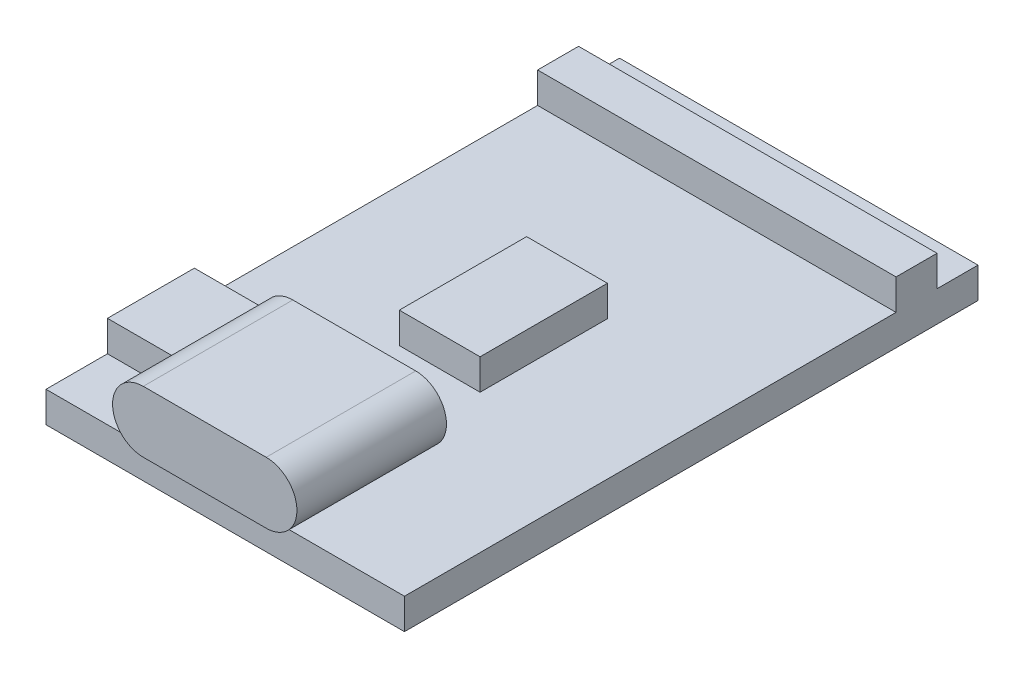
ISO-10303-21;
HEADER;
FILE_DESCRIPTION(('STEP AP214'),'2;1');
FILE_NAME('part.step','',(''),(''),'','','');
FILE_SCHEMA(('AUTOMOTIVE_DESIGN { 1 0 10303 214 1 1 1 1 }'));
ENDSEC;
DATA;
#1=APPLICATION_CONTEXT('core data for automotive mechanical design processes');
#2=APPLICATION_PROTOCOL_DEFINITION('international standard','automotive_design',2000,#1);
#3=PRODUCT_CONTEXT('',#1,'mechanical');
#4=PRODUCT('Part','Part','',(#3));
#5=PRODUCT_RELATED_PRODUCT_CATEGORY('part','',(#4));
#6=PRODUCT_DEFINITION_FORMATION('','',#4);
#7=PRODUCT_DEFINITION_CONTEXT('part definition',#1,'design');
#8=PRODUCT_DEFINITION('design','',#6,#7);
#9=PRODUCT_DEFINITION_SHAPE('','',#8);
#10=(LENGTH_UNIT() NAMED_UNIT(*) SI_UNIT(.MILLI.,.METRE.));
#11=(NAMED_UNIT(*) PLANE_ANGLE_UNIT() SI_UNIT($,.RADIAN.));
#12=(NAMED_UNIT(*) SI_UNIT($,.STERADIAN.) SOLID_ANGLE_UNIT());
#13=UNCERTAINTY_MEASURE_WITH_UNIT(LENGTH_MEASURE(1.E-05),#10,'distance_accuracy_value','');
#14=(GEOMETRIC_REPRESENTATION_CONTEXT(3) GLOBAL_UNCERTAINTY_ASSIGNED_CONTEXT((#13)) GLOBAL_UNIT_ASSIGNED_CONTEXT((#10,
#11,#12)) REPRESENTATION_CONTEXT('',''));
#15=CARTESIAN_POINT('',(0.,0.,0.));
#16=DIRECTION('',(0.,0.,1.));
#17=DIRECTION('',(1.,0.,0.));
#18=AXIS2_PLACEMENT_3D('',#15,#16,#17);
#19=CARTESIAN_POINT('',(-3.,3.5,-6.3));
#20=DIRECTION('',(0.,0.,1.));
#21=DIRECTION('',(1.,0.,0.));
#22=AXIS2_PLACEMENT_3D('',#19,#20,#21);
#23=CYLINDRICAL_SURFACE('',#22,1.5);
#24=CARTESIAN_POINT('',(-3.,3.5,1.));
#25=DIRECTION('',(0.,0.,1.));
#26=DIRECTION('',(1.,0.,0.));
#27=AXIS2_PLACEMENT_3D('',#24,#25,#26);
#28=CIRCLE('',#27,1.5);
#29=CARTESIAN_POINT('',(-3.,5.,1.));
#30=VERTEX_POINT('',#29);
#31=CARTESIAN_POINT('',(-3.,2.,1.));
#32=VERTEX_POINT('',#31);
#33=EDGE_CURVE('E119',#30,#32,#28,.T.);
#34=ORIENTED_EDGE('',*,*,#33,.F.);
#35=DIRECTION('',(0.,0.,1.));
#36=VECTOR('',#35,1.);
#37=CARTESIAN_POINT('',(-3.,5.,-6.3));
#38=LINE('',#37,#36);
#39=CARTESIAN_POINT('',(-3.,5.,-6.3));
#40=VERTEX_POINT('',#39);
#41=EDGE_CURVE('E14',#40,#30,#38,.T.);
#42=ORIENTED_EDGE('',*,*,#41,.F.);
#43=CARTESIAN_POINT('',(-3.,3.5,-6.3));
#44=DIRECTION('',(0.,0.,1.));
#45=DIRECTION('',(1.,0.,0.));
#46=AXIS2_PLACEMENT_3D('',#43,#44,#45);
#47=CIRCLE('',#46,1.5);
#48=CARTESIAN_POINT('',(-3.,2.,-6.3));
#49=VERTEX_POINT('',#48);
#50=EDGE_CURVE('E113',#40,#49,#47,.T.);
#51=ORIENTED_EDGE('',*,*,#50,.T.);
#52=DIRECTION('',(0.,0.,1.));
#53=VECTOR('',#52,1.);
#54=CARTESIAN_POINT('',(-3.,2.,-6.3));
#55=LINE('',#54,#53);
#56=EDGE_CURVE('E58',#49,#32,#55,.T.);
#57=ORIENTED_EDGE('',*,*,#56,.T.);
#58=EDGE_LOOP('',(#34,#42,#51,#57));
#59=FACE_BOUND('',#58,.T.);
#60=ADVANCED_FACE('F55',(#59),#23,.T.);
#61=CARTESIAN_POINT('',(-3.,5.,-6.3));
#62=DIRECTION('',(0.,1.,0.));
#63=DIRECTION('',(-1.,0.,0.));
#64=AXIS2_PLACEMENT_3D('',#61,#62,#63);
#65=PLANE('',#64);
#66=DIRECTION('',(-1.,0.,0.));
#67=VECTOR('',#66,1.);
#68=CARTESIAN_POINT('',(-3.,5.,1.));
#69=LINE('',#68,#67);
#70=CARTESIAN_POINT('',(3.,5.,1.));
#71=VERTEX_POINT('',#70);
#72=EDGE_CURVE('E115',#71,#30,#69,.T.);
#73=ORIENTED_EDGE('',*,*,#72,.F.);
#74=DIRECTION('',(0.,0.,1.));
#75=VECTOR('',#74,1.);
#76=CARTESIAN_POINT('',(3.,5.,-6.3));
#77=LINE('',#76,#75);
#78=CARTESIAN_POINT('',(3.,5.,-6.3));
#79=VERTEX_POINT('',#78);
#80=EDGE_CURVE('E64',#79,#71,#77,.T.);
#81=ORIENTED_EDGE('',*,*,#80,.F.);
#82=DIRECTION('',(-1.,0.,0.));
#83=VECTOR('',#82,1.);
#84=CARTESIAN_POINT('',(-3.,5.,-6.3));
#85=LINE('',#84,#83);
#86=EDGE_CURVE('E110',#79,#40,#85,.T.);
#87=ORIENTED_EDGE('',*,*,#86,.T.);
#88=ORIENTED_EDGE('',*,*,#41,.T.);
#89=EDGE_LOOP('',(#73,#81,#87,#88));
#90=FACE_BOUND('',#89,.T.);
#91=ADVANCED_FACE('F129',(#90),#65,.T.);
#92=CARTESIAN_POINT('',(3.,3.5,-6.3));
#93=DIRECTION('',(0.,0.,1.));
#94=DIRECTION('',(1.,0.,0.));
#95=AXIS2_PLACEMENT_3D('',#92,#93,#94);
#96=CYLINDRICAL_SURFACE('',#95,1.5);
#97=CARTESIAN_POINT('',(3.,3.5,1.));
#98=DIRECTION('',(0.,0.,1.));
#99=DIRECTION('',(1.,0.,0.));
#100=AXIS2_PLACEMENT_3D('',#97,#98,#99);
#101=CIRCLE('',#100,1.5);
#102=CARTESIAN_POINT('',(3.,2.,1.));
#103=VERTEX_POINT('',#102);
#104=EDGE_CURVE('E105',#103,#71,#101,.T.);
#105=ORIENTED_EDGE('',*,*,#104,.F.);
#106=DIRECTION('',(0.,0.,1.));
#107=VECTOR('',#106,1.);
#108=CARTESIAN_POINT('',(3.,2.,-6.3));
#109=LINE('',#108,#107);
#110=CARTESIAN_POINT('',(3.,2.,-6.3));
#111=VERTEX_POINT('',#110);
#112=EDGE_CURVE('E100',#111,#103,#109,.T.);
#113=ORIENTED_EDGE('',*,*,#112,.F.);
#114=CARTESIAN_POINT('',(3.,3.5,-6.3));
#115=DIRECTION('',(0.,0.,1.));
#116=DIRECTION('',(1.,0.,0.));
#117=AXIS2_PLACEMENT_3D('',#114,#115,#116);
#118=CIRCLE('',#117,1.5);
#119=EDGE_CURVE('E103',#111,#79,#118,.T.);
#120=ORIENTED_EDGE('',*,*,#119,.T.);
#121=ORIENTED_EDGE('',*,*,#80,.T.);
#122=EDGE_LOOP('',(#105,#113,#120,#121));
#123=FACE_BOUND('',#122,.T.);
#124=ADVANCED_FACE('F102',(#123),#96,.T.);
#125=CARTESIAN_POINT('',(-3.,2.,-6.3));
#126=DIRECTION('',(0.,-1.,0.));
#127=DIRECTION('',(1.,0.,0.));
#128=AXIS2_PLACEMENT_3D('',#125,#126,#127);
#129=PLANE('',#128);
#130=DIRECTION('',(1.,0.,0.));
#131=VECTOR('',#130,1.);
#132=CARTESIAN_POINT('',(-3.,2.,1.));
#133=LINE('',#132,#131);
#134=EDGE_CURVE('E122',#32,#103,#133,.T.);
#135=ORIENTED_EDGE('',*,*,#134,.F.);
#136=ORIENTED_EDGE('',*,*,#56,.F.);
#137=DIRECTION('',(1.,0.,0.));
#138=VECTOR('',#137,1.);
#139=CARTESIAN_POINT('',(-3.,2.,-6.3));
#140=LINE('',#139,#138);
#141=EDGE_CURVE('E109',#49,#111,#140,.T.);
#142=ORIENTED_EDGE('',*,*,#141,.T.);
#143=ORIENTED_EDGE('',*,*,#112,.T.);
#144=EDGE_LOOP('',(#135,#136,#142,#143));
#145=FACE_BOUND('',#144,.T.);
#146=ADVANCED_FACE('F112',(#145),#129,.T.);
#147=CARTESIAN_POINT('',(-3.,3.5,-6.3));
#148=DIRECTION('',(0.,0.,1.));
#149=DIRECTION('',(1.,0.,0.));
#150=AXIS2_PLACEMENT_3D('',#147,#148,#149);
#151=PLANE('',#150);
#152=ORIENTED_EDGE('',*,*,#50,.F.);
#153=ORIENTED_EDGE('',*,*,#86,.F.);
#154=ORIENTED_EDGE('',*,*,#119,.F.);
#155=ORIENTED_EDGE('',*,*,#141,.F.);
#156=EDGE_LOOP('',(#152,#153,#154,#155));
#157=FACE_BOUND('',#156,.T.);
#158=ADVANCED_FACE('F108',(#157),#151,.F.);
#159=CARTESIAN_POINT('',(-3.,3.5,1.));
#160=DIRECTION('',(0.,0.,1.));
#161=DIRECTION('',(1.,0.,0.));
#162=AXIS2_PLACEMENT_3D('',#159,#160,#161);
#163=PLANE('',#162);
#164=ORIENTED_EDGE('',*,*,#33,.T.);
#165=ORIENTED_EDGE('',*,*,#134,.T.);
#166=ORIENTED_EDGE('',*,*,#104,.T.);
#167=ORIENTED_EDGE('',*,*,#72,.T.);
#168=EDGE_LOOP('',(#164,#165,#166,#167));
#169=FACE_BOUND('',#168,.T.);
#170=ADVANCED_FACE('F128',(#169),#163,.T.);
#171=CLOSED_SHELL('',(#60,#91,#124,#146,#158,#170));
#172=MANIFOLD_SOLID_BREP('B2',#171);
#173=CARTESIAN_POINT('',(0.,1.5,0.));
#174=DIRECTION('',(0.,-1.,0.));
#175=DIRECTION('',(0.,0.,-1.));
#176=AXIS2_PLACEMENT_3D('',#173,#174,#175);
#177=PLANE('',#176);
#178=DIRECTION('',(0.,0.,1.));
#179=VECTOR('',#178,1.);
#180=CARTESIAN_POINT('',(-1.97208331803018,1.5,0.));
#181=LINE('',#180,#179);
#182=CARTESIAN_POINT('',(-1.97208331803018,1.5,-16.6852062003594));
#183=VERTEX_POINT('',#182);
#184=CARTESIAN_POINT('',(-1.97208331803018,1.5,-10.470155743537));
#185=VERTEX_POINT('',#184);
#186=EDGE_CURVE('E379',#183,#185,#181,.T.);
#187=ORIENTED_EDGE('',*,*,#186,.F.);
#188=DIRECTION('',(-1.,0.,0.));
#189=VECTOR('',#188,1.);
#190=CARTESIAN_POINT('',(0.,1.5,-16.6852062003594));
#191=LINE('',#190,#189);
#192=CARTESIAN_POINT('',(1.97208331803018,1.5,-16.6852062003594));
#193=VERTEX_POINT('',#192);
#194=EDGE_CURVE('E370',#193,#183,#191,.T.);
#195=ORIENTED_EDGE('',*,*,#194,.F.);
#196=DIRECTION('',(0.,0.,-1.));
#197=VECTOR('',#196,1.);
#198=CARTESIAN_POINT('',(1.97208331803019,1.5,0.));
#199=LINE('',#198,#197);
#200=CARTESIAN_POINT('',(1.97208331803018,1.5,-10.470155743537));
#201=VERTEX_POINT('',#200);
#202=EDGE_CURVE('E373',#201,#193,#199,.T.);
#203=ORIENTED_EDGE('',*,*,#202,.F.);
#204=DIRECTION('',(1.,0.,0.));
#205=VECTOR('',#204,1.);
#206=CARTESIAN_POINT('',(0.,1.5,-10.470155743537));
#207=LINE('',#206,#205);
#208=EDGE_CURVE('E376',#185,#201,#207,.T.);
#209=ORIENTED_EDGE('',*,*,#208,.F.);
#210=EDGE_LOOP('',(#187,#195,#203,#209));
#211=FACE_BOUND('',#210,.T.);
#212=DIRECTION('',(1.,0.,0.));
#213=VECTOR('',#212,1.);
#214=CARTESIAN_POINT('',(0.,1.5,-24.));
#215=LINE('',#214,#213);
#216=CARTESIAN_POINT('',(-8.75000000000001,1.5,-24.));
#217=VERTEX_POINT('',#216);
#218=CARTESIAN_POINT('',(8.75,1.5,-24.));
#219=VERTEX_POINT('',#218);
#220=EDGE_CURVE('E193',#217,#219,#215,.T.);
#221=ORIENTED_EDGE('',*,*,#220,.F.);
#222=DIRECTION('',(0.,0.,1.));
#223=VECTOR('',#222,1.);
#224=CARTESIAN_POINT('',(-8.75,1.5,0.));
#225=LINE('',#224,#223);
#226=CARTESIAN_POINT('',(-8.75,1.5,-7.24311031403309));
#227=VERTEX_POINT('',#226);
#228=EDGE_CURVE('E312',#217,#227,#225,.T.);
#229=ORIENTED_EDGE('',*,*,#228,.T.);
#230=DIRECTION('',(-1.,0.,0.));
#231=VECTOR('',#230,1.);
#232=CARTESIAN_POINT('',(0.,1.5,-7.24311031403309));
#233=LINE('',#232,#231);
#234=CARTESIAN_POINT('',(-5.29872891511141,1.5,-7.24311031403309));
#235=VERTEX_POINT('',#234);
#236=EDGE_CURVE('E340',#235,#227,#233,.T.);
#237=ORIENTED_EDGE('',*,*,#236,.F.);
#238=DIRECTION('',(0.,0.,-1.));
#239=VECTOR('',#238,1.);
#240=CARTESIAN_POINT('',(-5.29872891511141,1.5,0.));
#241=LINE('',#240,#239);
#242=CARTESIAN_POINT('',(-5.29872891511141,1.5,-3.));
#243=VERTEX_POINT('',#242);
#244=EDGE_CURVE('E343',#243,#235,#241,.T.);
#245=ORIENTED_EDGE('',*,*,#244,.F.);
#246=DIRECTION('',(1.,0.,0.));
#247=VECTOR('',#246,1.);
#248=CARTESIAN_POINT('',(0.,1.5,-3.));
#249=LINE('',#248,#247);
#250=CARTESIAN_POINT('',(-8.75,1.5,-3.));
#251=VERTEX_POINT('',#250);
#252=EDGE_CURVE('E346',#251,#243,#249,.T.);
#253=ORIENTED_EDGE('',*,*,#252,.F.);
#254=CARTESIAN_POINT('',(-8.75,1.5,0.));
#255=VERTEX_POINT('',#254);
#256=EDGE_CURVE('E386',#251,#255,#225,.T.);
#257=ORIENTED_EDGE('',*,*,#256,.T.);
#258=DIRECTION('',(1.,0.,0.));
#259=VECTOR('',#258,1.);
#260=CARTESIAN_POINT('',(-8.75,1.5,0.));
#261=LINE('',#260,#259);
#262=CARTESIAN_POINT('',(8.75,1.5,0.));
#263=VERTEX_POINT('',#262);
#264=EDGE_CURVE('E385',#255,#263,#261,.T.);
#265=ORIENTED_EDGE('',*,*,#264,.T.);
#266=DIRECTION('',(0.,0.,-1.));
#267=VECTOR('',#266,1.);
#268=CARTESIAN_POINT('',(8.75,1.5,0.));
#269=LINE('',#268,#267);
#270=EDGE_CURVE('E389',#263,#219,#269,.T.);
#271=ORIENTED_EDGE('',*,*,#270,.T.);
#272=EDGE_LOOP('',(#221,#229,#237,#245,#253,#257,#265,#271));
#273=FACE_BOUND('',#272,.T.);
#274=ADVANCED_FACE('F178',(#211,#273),#177,.F.);
#275=DIRECTION('',(-1.,0.,0.));
#276=VECTOR('',#275,1.);
#277=CARTESIAN_POINT('',(0.,1.5,-26.));
#278=LINE('',#277,#276);
#279=CARTESIAN_POINT('',(8.75,1.5,-26.));
#280=VERTEX_POINT('',#279);
#281=CARTESIAN_POINT('',(-8.75000000000001,1.5,-26.));
#282=VERTEX_POINT('',#281);
#283=EDGE_CURVE('E201',#280,#282,#278,.T.);
#284=ORIENTED_EDGE('',*,*,#283,.F.);
#285=CARTESIAN_POINT('',(8.75,1.5,-28.));
#286=VERTEX_POINT('',#285);
#287=EDGE_CURVE('E388',#280,#286,#269,.T.);
#288=ORIENTED_EDGE('',*,*,#287,.T.);
#289=DIRECTION('',(-1.,0.,0.));
#290=VECTOR('',#289,1.);
#291=CARTESIAN_POINT('',(-8.75000000000001,1.5,-28.));
#292=LINE('',#291,#290);
#293=CARTESIAN_POINT('',(-8.75000000000001,1.5,-28.));
#294=VERTEX_POINT('',#293);
#295=EDGE_CURVE('E391',#286,#294,#292,.T.);
#296=ORIENTED_EDGE('',*,*,#295,.T.);
#297=EDGE_CURVE('E383',#294,#282,#225,.T.);
#298=ORIENTED_EDGE('',*,*,#297,.T.);
#299=EDGE_LOOP('',(#284,#288,#296,#298));
#300=FACE_BOUND('',#299,.T.);
#301=ADVANCED_FACE('F426',(#300),#177,.F.);
#302=CARTESIAN_POINT('',(-8.75,1.5,0.));
#303=DIRECTION('',(1.,0.,0.));
#304=DIRECTION('',(0.,0.,-1.));
#305=AXIS2_PLACEMENT_3D('',#302,#303,#304);
#306=PLANE('',#305);
#307=DIRECTION('',(0.,0.,1.));
#308=VECTOR('',#307,1.);
#309=CARTESIAN_POINT('',(-8.75,0.,0.));
#310=LINE('',#309,#308);
#311=CARTESIAN_POINT('',(-8.75000000000001,0.,-28.));
#312=VERTEX_POINT('',#311);
#313=CARTESIAN_POINT('',(-8.75,0.,0.));
#314=VERTEX_POINT('',#313);
#315=EDGE_CURVE('E382',#312,#314,#310,.T.);
#316=ORIENTED_EDGE('',*,*,#315,.T.);
#317=DIRECTION('',(0.,-1.,0.));
#318=VECTOR('',#317,1.);
#319=CARTESIAN_POINT('',(-8.75,1.5,0.));
#320=LINE('',#319,#318);
#321=EDGE_CURVE('E53',#255,#314,#320,.T.);
#322=ORIENTED_EDGE('',*,*,#321,.F.);
#323=ORIENTED_EDGE('',*,*,#256,.F.);
#324=DIRECTION('',(0.,-1.,0.));
#325=VECTOR('',#324,1.);
#326=CARTESIAN_POINT('',(-8.75000000000001,3.,-3.));
#327=LINE('',#326,#325);
#328=CARTESIAN_POINT('',(-8.75000000000001,3.,-3.));
#329=VERTEX_POINT('',#328);
#330=EDGE_CURVE('E337',#329,#251,#327,.T.);
#331=ORIENTED_EDGE('',*,*,#330,.F.);
#332=DIRECTION('',(0.,0.,1.));
#333=VECTOR('',#332,1.);
#334=CARTESIAN_POINT('',(-8.75000000000001,3.,-3.));
#335=LINE('',#334,#333);
#336=CARTESIAN_POINT('',(-8.75,3.,-7.24311031403309));
#337=VERTEX_POINT('',#336);
#338=EDGE_CURVE('E320',#337,#329,#335,.T.);
#339=ORIENTED_EDGE('',*,*,#338,.F.);
#340=DIRECTION('',(0.,-1.,0.));
#341=VECTOR('',#340,1.);
#342=CARTESIAN_POINT('',(-8.75,3.,-7.24311031403309));
#343=LINE('',#342,#341);
#344=EDGE_CURVE('E329',#337,#227,#343,.T.);
#345=ORIENTED_EDGE('',*,*,#344,.T.);
#346=ORIENTED_EDGE('',*,*,#228,.F.);
#347=DIRECTION('',(0.,-1.,0.));
#348=VECTOR('',#347,1.);
#349=CARTESIAN_POINT('',(-8.75000000000001,3.,-24.));
#350=LINE('',#349,#348);
#351=CARTESIAN_POINT('',(-8.75000000000001,3.,-24.));
#352=VERTEX_POINT('',#351);
#353=EDGE_CURVE('E295',#352,#217,#350,.T.);
#354=ORIENTED_EDGE('',*,*,#353,.F.);
#355=DIRECTION('',(0.,0.,1.));
#356=VECTOR('',#355,1.);
#357=CARTESIAN_POINT('',(-8.75000000000001,3.,-26.));
#358=LINE('',#357,#356);
#359=CARTESIAN_POINT('',(-8.75000000000001,3.,-26.));
#360=VERTEX_POINT('',#359);
#361=EDGE_CURVE('E301',#360,#352,#358,.T.);
#362=ORIENTED_EDGE('',*,*,#361,.F.);
#363=DIRECTION('',(0.,-1.,0.));
#364=VECTOR('',#363,1.);
#365=CARTESIAN_POINT('',(-8.75000000000001,3.,-26.));
#366=LINE('',#365,#364);
#367=EDGE_CURVE('E425',#360,#282,#366,.T.);
#368=ORIENTED_EDGE('',*,*,#367,.T.);
#369=ORIENTED_EDGE('',*,*,#297,.F.);
#370=DIRECTION('',(0.,-1.,0.));
#371=VECTOR('',#370,1.);
#372=CARTESIAN_POINT('',(-8.75000000000001,1.5,-28.));
#373=LINE('',#372,#371);
#374=EDGE_CURVE('E393',#294,#312,#373,.T.);
#375=ORIENTED_EDGE('',*,*,#374,.T.);
#376=EDGE_LOOP('',(#316,#322,#323,#331,#339,#345,#346,#354,#362,#368,#369,#375));
#377=FACE_BOUND('',#376,.T.);
#378=ADVANCED_FACE('F180',(#377),#306,.F.);
#379=CARTESIAN_POINT('',(-8.75,1.5,0.));
#380=DIRECTION('',(0.,0.,-1.));
#381=DIRECTION('',(-1.,0.,0.));
#382=AXIS2_PLACEMENT_3D('',#379,#380,#381);
#383=PLANE('',#382);
#384=DIRECTION('',(1.,0.,0.));
#385=VECTOR('',#384,1.);
#386=CARTESIAN_POINT('',(-8.75,0.,0.));
#387=LINE('',#386,#385);
#388=CARTESIAN_POINT('',(8.75,0.,0.));
#389=VERTEX_POINT('',#388);
#390=EDGE_CURVE('E395',#314,#389,#387,.T.);
#391=ORIENTED_EDGE('',*,*,#390,.T.);
#392=DIRECTION('',(0.,-1.,0.));
#393=VECTOR('',#392,1.);
#394=CARTESIAN_POINT('',(8.75,1.5,0.));
#395=LINE('',#394,#393);
#396=EDGE_CURVE('E186',#263,#389,#395,.T.);
#397=ORIENTED_EDGE('',*,*,#396,.F.);
#398=ORIENTED_EDGE('',*,*,#264,.F.);
#399=ORIENTED_EDGE('',*,*,#321,.T.);
#400=EDGE_LOOP('',(#391,#397,#398,#399));
#401=FACE_BOUND('',#400,.T.);
#402=ADVANCED_FACE('F458',(#401),#383,.F.);
#403=CARTESIAN_POINT('',(8.75,1.5,0.));
#404=DIRECTION('',(-1.,0.,0.));
#405=DIRECTION('',(0.,0.,1.));
#406=AXIS2_PLACEMENT_3D('',#403,#404,#405);
#407=PLANE('',#406);
#408=ORIENTED_EDGE('',*,*,#287,.F.);
#409=DIRECTION('',(0.,-1.,0.));
#410=VECTOR('',#409,1.);
#411=CARTESIAN_POINT('',(8.75,3.,-26.));
#412=LINE('',#411,#410);
#413=CARTESIAN_POINT('',(8.75,3.,-26.));
#414=VERTEX_POINT('',#413);
#415=EDGE_CURVE('E315',#414,#280,#412,.T.);
#416=ORIENTED_EDGE('',*,*,#415,.F.);
#417=DIRECTION('',(0.,0.,-1.));
#418=VECTOR('',#417,1.);
#419=CARTESIAN_POINT('',(8.75,3.,-26.));
#420=LINE('',#419,#418);
#421=CARTESIAN_POINT('',(8.75000000000001,3.,-24.));
#422=VERTEX_POINT('',#421);
#423=EDGE_CURVE('E300',#422,#414,#420,.T.);
#424=ORIENTED_EDGE('',*,*,#423,.F.);
#425=DIRECTION('',(0.,-1.,0.));
#426=VECTOR('',#425,1.);
#427=CARTESIAN_POINT('',(8.75000000000001,3.,-24.));
#428=LINE('',#427,#426);
#429=EDGE_CURVE('E297',#422,#219,#428,.T.);
#430=ORIENTED_EDGE('',*,*,#429,.T.);
#431=ORIENTED_EDGE('',*,*,#270,.F.);
#432=ORIENTED_EDGE('',*,*,#396,.T.);
#433=DIRECTION('',(0.,0.,-1.));
#434=VECTOR('',#433,1.);
#435=CARTESIAN_POINT('',(8.75,0.,0.));
#436=LINE('',#435,#434);
#437=CARTESIAN_POINT('',(8.75,0.,-28.));
#438=VERTEX_POINT('',#437);
#439=EDGE_CURVE('E397',#389,#438,#436,.T.);
#440=ORIENTED_EDGE('',*,*,#439,.T.);
#441=DIRECTION('',(0.,-1.,0.));
#442=VECTOR('',#441,1.);
#443=CARTESIAN_POINT('',(8.75,1.5,-28.));
#444=LINE('',#443,#442);
#445=EDGE_CURVE('E403',#286,#438,#444,.T.);
#446=ORIENTED_EDGE('',*,*,#445,.F.);
#447=EDGE_LOOP('',(#408,#416,#424,#430,#431,#432,#440,#446));
#448=FACE_BOUND('',#447,.T.);
#449=ADVANCED_FACE('F410',(#448),#407,.F.);
#450=CARTESIAN_POINT('',(-8.75000000000001,1.5,-28.));
#451=DIRECTION('',(0.,0.,1.));
#452=DIRECTION('',(1.,0.,0.));
#453=AXIS2_PLACEMENT_3D('',#450,#451,#452);
#454=PLANE('',#453);
#455=DIRECTION('',(-1.,0.,0.));
#456=VECTOR('',#455,1.);
#457=CARTESIAN_POINT('',(-8.75000000000001,0.,-28.));
#458=LINE('',#457,#456);
#459=EDGE_CURVE('E399',#438,#312,#458,.T.);
#460=ORIENTED_EDGE('',*,*,#459,.T.);
#461=ORIENTED_EDGE('',*,*,#374,.F.);
#462=ORIENTED_EDGE('',*,*,#295,.F.);
#463=ORIENTED_EDGE('',*,*,#445,.T.);
#464=EDGE_LOOP('',(#460,#461,#462,#463));
#465=FACE_BOUND('',#464,.T.);
#466=ADVANCED_FACE('F421',(#465),#454,.F.);
#467=CARTESIAN_POINT('',(0.,0.,0.));
#468=DIRECTION('',(0.,-1.,0.));
#469=DIRECTION('',(0.,0.,-1.));
#470=AXIS2_PLACEMENT_3D('',#467,#468,#469);
#471=PLANE('',#470);
#472=ORIENTED_EDGE('',*,*,#459,.F.);
#473=ORIENTED_EDGE('',*,*,#439,.F.);
#474=ORIENTED_EDGE('',*,*,#390,.F.);
#475=ORIENTED_EDGE('',*,*,#315,.F.);
#476=EDGE_LOOP('',(#472,#473,#474,#475));
#477=FACE_BOUND('',#476,.T.);
#478=ADVANCED_FACE('F417',(#477),#471,.T.);
#479=CARTESIAN_POINT('',(-1.97208331803018,3.,-10.470155743537));
#480=DIRECTION('',(1.,0.,0.));
#481=DIRECTION('',(0.,0.,-1.));
#482=AXIS2_PLACEMENT_3D('',#479,#480,#481);
#483=PLANE('',#482);
#484=DIRECTION('',(0.,-1.,0.));
#485=VECTOR('',#484,1.);
#486=CARTESIAN_POINT('',(-1.97208331803018,3.,-16.6852062003594));
#487=LINE('',#486,#485);
#488=CARTESIAN_POINT('',(-1.97208331803018,3.,-16.6852062003594));
#489=VERTEX_POINT('',#488);
#490=EDGE_CURVE('E358',#489,#183,#487,.T.);
#491=ORIENTED_EDGE('',*,*,#490,.T.);
#492=ORIENTED_EDGE('',*,*,#186,.T.);
#493=DIRECTION('',(0.,-1.,0.));
#494=VECTOR('',#493,1.);
#495=CARTESIAN_POINT('',(-1.97208331803018,3.,-10.470155743537));
#496=LINE('',#495,#494);
#497=CARTESIAN_POINT('',(-1.97208331803018,3.,-10.470155743537));
#498=VERTEX_POINT('',#497);
#499=EDGE_CURVE('E367',#498,#185,#496,.T.);
#500=ORIENTED_EDGE('',*,*,#499,.F.);
#501=DIRECTION('',(0.,0.,1.));
#502=VECTOR('',#501,1.);
#503=CARTESIAN_POINT('',(-1.97208331803018,3.,-10.470155743537));
#504=LINE('',#503,#502);
#505=EDGE_CURVE('E349',#489,#498,#504,.T.);
#506=ORIENTED_EDGE('',*,*,#505,.F.);
#507=EDGE_LOOP('',(#491,#492,#500,#506));
#508=FACE_BOUND('',#507,.T.);
#509=ADVANCED_FACE('F451',(#508),#483,.F.);
#510=CARTESIAN_POINT('',(-1.97208331803018,3.,-10.470155743537));
#511=DIRECTION('',(0.,0.,-1.));
#512=DIRECTION('',(-1.,0.,0.));
#513=AXIS2_PLACEMENT_3D('',#510,#511,#512);
#514=PLANE('',#513);
#515=ORIENTED_EDGE('',*,*,#499,.T.);
#516=ORIENTED_EDGE('',*,*,#208,.T.);
#517=DIRECTION('',(0.,-1.,0.));
#518=VECTOR('',#517,1.);
#519=CARTESIAN_POINT('',(1.97208331803018,3.,-10.470155743537));
#520=LINE('',#519,#518);
#521=CARTESIAN_POINT('',(1.97208331803018,3.,-10.470155743537));
#522=VERTEX_POINT('',#521);
#523=EDGE_CURVE('E364',#522,#201,#520,.T.);
#524=ORIENTED_EDGE('',*,*,#523,.F.);
#525=DIRECTION('',(1.,0.,0.));
#526=VECTOR('',#525,1.);
#527=CARTESIAN_POINT('',(-1.97208331803018,3.,-10.470155743537));
#528=LINE('',#527,#526);
#529=EDGE_CURVE('E352',#498,#522,#528,.T.);
#530=ORIENTED_EDGE('',*,*,#529,.F.);
#531=EDGE_LOOP('',(#515,#516,#524,#530));
#532=FACE_BOUND('',#531,.T.);
#533=ADVANCED_FACE('F498',(#532),#514,.F.);
#534=CARTESIAN_POINT('',(1.97208331803018,3.,-10.470155743537));
#535=DIRECTION('',(-1.,0.,0.));
#536=DIRECTION('',(0.,0.,1.));
#537=AXIS2_PLACEMENT_3D('',#534,#535,#536);
#538=PLANE('',#537);
#539=ORIENTED_EDGE('',*,*,#523,.T.);
#540=ORIENTED_EDGE('',*,*,#202,.T.);
#541=DIRECTION('',(0.,-1.,0.));
#542=VECTOR('',#541,1.);
#543=CARTESIAN_POINT('',(1.97208331803018,3.,-16.6852062003594));
#544=LINE('',#543,#542);
#545=CARTESIAN_POINT('',(1.97208331803018,3.,-16.6852062003594));
#546=VERTEX_POINT('',#545);
#547=EDGE_CURVE('E361',#546,#193,#544,.T.);
#548=ORIENTED_EDGE('',*,*,#547,.F.);
#549=DIRECTION('',(0.,0.,-1.));
#550=VECTOR('',#549,1.);
#551=CARTESIAN_POINT('',(1.97208331803018,3.,-10.470155743537));
#552=LINE('',#551,#550);
#553=EDGE_CURVE('E354',#522,#546,#552,.T.);
#554=ORIENTED_EDGE('',*,*,#553,.F.);
#555=EDGE_LOOP('',(#539,#540,#548,#554));
#556=FACE_BOUND('',#555,.T.);
#557=ADVANCED_FACE('F495',(#556),#538,.F.);
#558=CARTESIAN_POINT('',(-1.97208331803018,3.,-16.6852062003594));
#559=DIRECTION('',(0.,0.,1.));
#560=DIRECTION('',(1.,0.,0.));
#561=AXIS2_PLACEMENT_3D('',#558,#559,#560);
#562=PLANE('',#561);
#563=ORIENTED_EDGE('',*,*,#547,.T.);
#564=ORIENTED_EDGE('',*,*,#194,.T.);
#565=ORIENTED_EDGE('',*,*,#490,.F.);
#566=DIRECTION('',(-1.,0.,0.));
#567=VECTOR('',#566,1.);
#568=CARTESIAN_POINT('',(-1.97208331803018,3.,-16.6852062003594));
#569=LINE('',#568,#567);
#570=EDGE_CURVE('E356',#546,#489,#569,.T.);
#571=ORIENTED_EDGE('',*,*,#570,.F.);
#572=EDGE_LOOP('',(#563,#564,#565,#571));
#573=FACE_BOUND('',#572,.T.);
#574=ADVANCED_FACE('F491',(#573),#562,.F.);
#575=CARTESIAN_POINT('',(0.,3.,0.));
#576=DIRECTION('',(0.,-1.,0.));
#577=DIRECTION('',(0.,0.,-1.));
#578=AXIS2_PLACEMENT_3D('',#575,#576,#577);
#579=PLANE('',#578);
#580=ORIENTED_EDGE('',*,*,#505,.T.);
#581=ORIENTED_EDGE('',*,*,#529,.T.);
#582=ORIENTED_EDGE('',*,*,#553,.T.);
#583=ORIENTED_EDGE('',*,*,#570,.T.);
#584=EDGE_LOOP('',(#580,#581,#582,#583));
#585=FACE_BOUND('',#584,.T.);
#586=ADVANCED_FACE('F485',(#585),#579,.F.);
#587=CARTESIAN_POINT('',(-8.75000000000001,3.,-3.));
#588=DIRECTION('',(0.,0.,-1.));
#589=DIRECTION('',(-1.,0.,0.));
#590=AXIS2_PLACEMENT_3D('',#587,#588,#589);
#591=PLANE('',#590);
#592=ORIENTED_EDGE('',*,*,#330,.T.);
#593=ORIENTED_EDGE('',*,*,#252,.T.);
#594=DIRECTION('',(0.,-1.,0.));
#595=VECTOR('',#594,1.);
#596=CARTESIAN_POINT('',(-5.29872891511141,3.,-3.));
#597=LINE('',#596,#595);
#598=CARTESIAN_POINT('',(-5.29872891511141,3.,-3.));
#599=VERTEX_POINT('',#598);
#600=EDGE_CURVE('E334',#599,#243,#597,.T.);
#601=ORIENTED_EDGE('',*,*,#600,.F.);
#602=DIRECTION('',(1.,0.,0.));
#603=VECTOR('',#602,1.);
#604=CARTESIAN_POINT('',(-8.75000000000001,3.,-3.));
#605=LINE('',#604,#603);
#606=EDGE_CURVE('E323',#329,#599,#605,.T.);
#607=ORIENTED_EDGE('',*,*,#606,.F.);
#608=EDGE_LOOP('',(#592,#593,#601,#607));
#609=FACE_BOUND('',#608,.T.);
#610=ADVANCED_FACE('F467',(#609),#591,.F.);
#611=CARTESIAN_POINT('',(-5.29872891511141,3.,-3.));
#612=DIRECTION('',(-1.,0.,0.));
#613=DIRECTION('',(0.,0.,1.));
#614=AXIS2_PLACEMENT_3D('',#611,#612,#613);
#615=PLANE('',#614);
#616=ORIENTED_EDGE('',*,*,#600,.T.);
#617=ORIENTED_EDGE('',*,*,#244,.T.);
#618=DIRECTION('',(0.,-1.,0.));
#619=VECTOR('',#618,1.);
#620=CARTESIAN_POINT('',(-5.29872891511141,3.,-7.24311031403309));
#621=LINE('',#620,#619);
#622=CARTESIAN_POINT('',(-5.29872891511141,3.,-7.24311031403309));
#623=VERTEX_POINT('',#622);
#624=EDGE_CURVE('E331',#623,#235,#621,.T.);
#625=ORIENTED_EDGE('',*,*,#624,.F.);
#626=DIRECTION('',(0.,0.,-1.));
#627=VECTOR('',#626,1.);
#628=CARTESIAN_POINT('',(-5.29872891511141,3.,-3.));
#629=LINE('',#628,#627);
#630=EDGE_CURVE('E325',#599,#623,#629,.T.);
#631=ORIENTED_EDGE('',*,*,#630,.F.);
#632=EDGE_LOOP('',(#616,#617,#625,#631));
#633=FACE_BOUND('',#632,.T.);
#634=ADVANCED_FACE('F477',(#633),#615,.F.);
#635=CARTESIAN_POINT('',(-8.75,3.,-7.24311031403309));
#636=DIRECTION('',(0.,0.,1.));
#637=DIRECTION('',(1.,0.,0.));
#638=AXIS2_PLACEMENT_3D('',#635,#636,#637);
#639=PLANE('',#638);
#640=ORIENTED_EDGE('',*,*,#624,.T.);
#641=ORIENTED_EDGE('',*,*,#236,.T.);
#642=ORIENTED_EDGE('',*,*,#344,.F.);
#643=DIRECTION('',(-1.,0.,0.));
#644=VECTOR('',#643,1.);
#645=CARTESIAN_POINT('',(-8.75,3.,-7.24311031403309));
#646=LINE('',#645,#644);
#647=EDGE_CURVE('E327',#623,#337,#646,.T.);
#648=ORIENTED_EDGE('',*,*,#647,.F.);
#649=EDGE_LOOP('',(#640,#641,#642,#648));
#650=FACE_BOUND('',#649,.T.);
#651=ADVANCED_FACE('F474',(#650),#639,.F.);
#652=CARTESIAN_POINT('',(0.,3.,0.));
#653=DIRECTION('',(0.,-1.,0.));
#654=DIRECTION('',(0.,0.,-1.));
#655=AXIS2_PLACEMENT_3D('',#652,#653,#654);
#656=PLANE('',#655);
#657=ORIENTED_EDGE('',*,*,#338,.T.);
#658=ORIENTED_EDGE('',*,*,#606,.T.);
#659=ORIENTED_EDGE('',*,*,#630,.T.);
#660=ORIENTED_EDGE('',*,*,#647,.T.);
#661=EDGE_LOOP('',(#657,#658,#659,#660));
#662=FACE_BOUND('',#661,.T.);
#663=ADVANCED_FACE('F441',(#662),#656,.F.);
#664=CARTESIAN_POINT('',(-8.75000000000001,3.,-24.));
#665=DIRECTION('',(0.,0.,-1.));
#666=DIRECTION('',(-1.,0.,0.));
#667=AXIS2_PLACEMENT_3D('',#664,#665,#666);
#668=PLANE('',#667);
#669=ORIENTED_EDGE('',*,*,#353,.T.);
#670=ORIENTED_EDGE('',*,*,#220,.T.);
#671=ORIENTED_EDGE('',*,*,#429,.F.);
#672=DIRECTION('',(1.,0.,0.));
#673=VECTOR('',#672,1.);
#674=CARTESIAN_POINT('',(-8.75000000000001,3.,-24.));
#675=LINE('',#674,#673);
#676=EDGE_CURVE('E291',#352,#422,#675,.T.);
#677=ORIENTED_EDGE('',*,*,#676,.F.);
#678=EDGE_LOOP('',(#669,#670,#671,#677));
#679=FACE_BOUND('',#678,.T.);
#680=ADVANCED_FACE('F293',(#679),#668,.F.);
#681=CARTESIAN_POINT('',(-8.75000000000001,3.,-26.));
#682=DIRECTION('',(0.,0.,1.));
#683=DIRECTION('',(1.,0.,0.));
#684=AXIS2_PLACEMENT_3D('',#681,#682,#683);
#685=PLANE('',#684);
#686=ORIENTED_EDGE('',*,*,#415,.T.);
#687=ORIENTED_EDGE('',*,*,#283,.T.);
#688=ORIENTED_EDGE('',*,*,#367,.F.);
#689=DIRECTION('',(-1.,0.,0.));
#690=VECTOR('',#689,1.);
#691=CARTESIAN_POINT('',(-8.75000000000001,3.,-26.));
#692=LINE('',#691,#690);
#693=EDGE_CURVE('E306',#414,#360,#692,.T.);
#694=ORIENTED_EDGE('',*,*,#693,.F.);
#695=EDGE_LOOP('',(#686,#687,#688,#694));
#696=FACE_BOUND('',#695,.T.);
#697=ADVANCED_FACE('F429',(#696),#685,.F.);
#698=CARTESIAN_POINT('',(0.,3.,0.));
#699=DIRECTION('',(0.,1.,0.));
#700=DIRECTION('',(0.,0.,1.));
#701=AXIS2_PLACEMENT_3D('',#698,#699,#700);
#702=PLANE('',#701);
#703=ORIENTED_EDGE('',*,*,#361,.T.);
#704=ORIENTED_EDGE('',*,*,#676,.T.);
#705=ORIENTED_EDGE('',*,*,#423,.T.);
#706=ORIENTED_EDGE('',*,*,#693,.T.);
#707=EDGE_LOOP('',(#703,#704,#705,#706));
#708=FACE_BOUND('',#707,.T.);
#709=ADVANCED_FACE('F304',(#708),#702,.T.);
#710=CLOSED_SHELL('',(#274,#301,#378,#402,#449,#466,#478,#509,#533,#557,#574,#586,#610,#634,
#651,#663,#680,#697,#709));
#711=MANIFOLD_SOLID_BREP('B8',#710);
#712=ADVANCED_BREP_SHAPE_REPRESENTATION('',(#18,#172,#711),#14);
#713=SHAPE_DEFINITION_REPRESENTATION(#9,#712);
ENDSEC;
END-ISO-10303-21;
